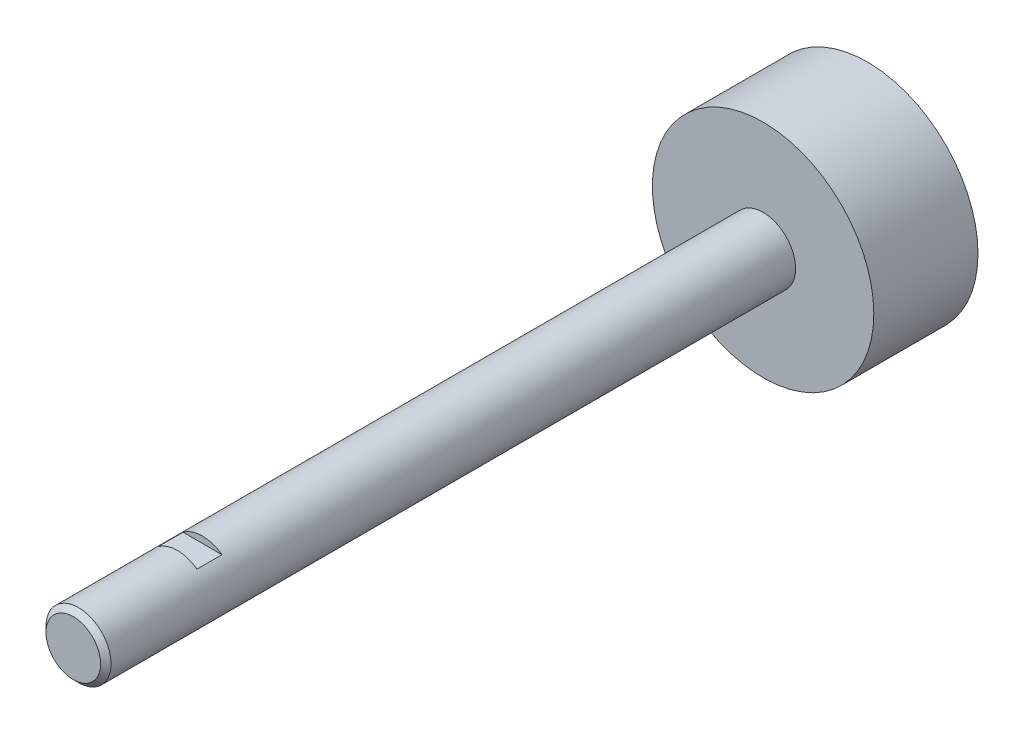
ISO-10303-21;
HEADER;
FILE_DESCRIPTION(('STEP AP214'),'2;1');
FILE_NAME('part.step','',(''),(''),'','','');
FILE_SCHEMA(('AUTOMOTIVE_DESIGN { 1 0 10303 214 1 1 1 1 }'));
ENDSEC;
DATA;
#1=APPLICATION_CONTEXT('core data for automotive mechanical design processes');
#2=APPLICATION_PROTOCOL_DEFINITION('international standard','automotive_design',2000,#1);
#3=PRODUCT_CONTEXT('',#1,'mechanical');
#4=PRODUCT('Part','Part','',(#3));
#5=PRODUCT_RELATED_PRODUCT_CATEGORY('part','',(#4));
#6=PRODUCT_DEFINITION_FORMATION('','',#4);
#7=PRODUCT_DEFINITION_CONTEXT('part definition',#1,'design');
#8=PRODUCT_DEFINITION('design','',#6,#7);
#9=PRODUCT_DEFINITION_SHAPE('','',#8);
#10=(LENGTH_UNIT() NAMED_UNIT(*) SI_UNIT(.MILLI.,.METRE.));
#11=(NAMED_UNIT(*) PLANE_ANGLE_UNIT() SI_UNIT($,.RADIAN.));
#12=(NAMED_UNIT(*) SI_UNIT($,.STERADIAN.) SOLID_ANGLE_UNIT());
#13=UNCERTAINTY_MEASURE_WITH_UNIT(LENGTH_MEASURE(1.E-05),#10,'distance_accuracy_value','');
#14=(GEOMETRIC_REPRESENTATION_CONTEXT(3) GLOBAL_UNCERTAINTY_ASSIGNED_CONTEXT((#13)) GLOBAL_UNIT_ASSIGNED_CONTEXT((#10,
#11,#12)) REPRESENTATION_CONTEXT('',''));
#15=CARTESIAN_POINT('',(0.,0.,0.));
#16=DIRECTION('',(0.,0.,1.));
#17=DIRECTION('',(1.,0.,0.));
#18=AXIS2_PLACEMENT_3D('',#15,#16,#17);
#19=CARTESIAN_POINT('',(-17.9826826144289,-14.224,-3.04800000000014));
#20=DIRECTION('',(0.,0.,-1.));
#21=DIRECTION('',(-1.,0.,0.));
#22=AXIS2_PLACEMENT_3D('',#19,#20,#21);
#23=PLANE('',#22);
#24=CARTESIAN_POINT('',(0.,0.,-3.04800000000014));
#25=DIRECTION('',(0.,0.,1.));
#26=DIRECTION('',(-0.429692042512657,0.902975497231957,0.));
#27=AXIS2_PLACEMENT_3D('',#24,#25,#26);
#28=CIRCLE('',#27,3.9624);
#29=CARTESIAN_POINT('',(-2.37065154757083,-3.175,-3.04800000000014));
#30=VERTEX_POINT('',#29);
#31=CARTESIAN_POINT('',(2.37065154757083,-3.175,-3.04800000000014));
#32=VERTEX_POINT('',#31);
#33=EDGE_CURVE('E127',#30,#32,#28,.T.);
#34=ORIENTED_EDGE('',*,*,#33,.T.);
#35=DIRECTION('',(1.,0.,0.));
#36=VECTOR('',#35,1.);
#37=CARTESIAN_POINT('',(-17.9826826144289,-3.175,-3.04800000000014));
#38=LINE('',#37,#36);
#39=EDGE_CURVE('E11',#30,#32,#38,.T.);
#40=ORIENTED_EDGE('',*,*,#39,.F.);
#41=EDGE_LOOP('',(#34,#40));
#42=FACE_BOUND('',#41,.T.);
#43=ADVANCED_FACE('F16',(#42),#23,.F.);
#44=CARTESIAN_POINT('',(-17.9826826144289,-3.175,0.));
#45=DIRECTION('',(0.,1.,0.));
#46=DIRECTION('',(0.,0.,-1.));
#47=AXIS2_PLACEMENT_3D('',#44,#45,#46);
#48=PLANE('',#47);
#49=DIRECTION('',(0.,0.,-1.));
#50=VECTOR('',#49,1.);
#51=CARTESIAN_POINT('',(-2.3706515475708,-3.175,-95.2813596390943));
#52=LINE('',#51,#50);
#53=CARTESIAN_POINT('',(-2.3706515475708,-3.175,0.));
#54=VERTEX_POINT('',#53);
#55=EDGE_CURVE('E132',#54,#30,#52,.T.);
#56=ORIENTED_EDGE('',*,*,#55,.T.);
#57=ORIENTED_EDGE('',*,*,#39,.T.);
#58=DIRECTION('',(0.,0.,1.));
#59=VECTOR('',#58,1.);
#60=CARTESIAN_POINT('',(2.3706515475708,-3.175,-95.2813596390943));
#61=LINE('',#60,#59);
#62=CARTESIAN_POINT('',(2.37065154757081,-3.175,0.));
#63=VERTEX_POINT('',#62);
#64=EDGE_CURVE('E123',#32,#63,#61,.T.);
#65=ORIENTED_EDGE('',*,*,#64,.T.);
#66=DIRECTION('',(1.,0.,0.));
#67=VECTOR('',#66,1.);
#68=CARTESIAN_POINT('',(-17.9826826144289,-3.175,0.));
#69=LINE('',#68,#67);
#70=EDGE_CURVE('E26',#54,#63,#69,.T.);
#71=ORIENTED_EDGE('',*,*,#70,.F.);
#72=EDGE_LOOP('',(#56,#57,#65,#71));
#73=FACE_BOUND('',#72,.T.);
#74=ADVANCED_FACE('F161',(#73),#48,.F.);
#75=CARTESIAN_POINT('',(-17.9826826144289,-14.224,0.));
#76=DIRECTION('',(0.,0.,1.));
#77=DIRECTION('',(0.,-1.,0.));
#78=AXIS2_PLACEMENT_3D('',#75,#76,#77);
#79=PLANE('',#78);
#80=CARTESIAN_POINT('',(0.,0.,0.));
#81=DIRECTION('',(0.,0.,-1.));
#82=DIRECTION('',(0.429692042512659,-0.902975497231957,0.));
#83=AXIS2_PLACEMENT_3D('',#80,#81,#82);
#84=CIRCLE('',#83,3.9624);
#85=EDGE_CURVE('E120',#63,#54,#84,.T.);
#86=ORIENTED_EDGE('',*,*,#85,.T.);
#87=ORIENTED_EDGE('',*,*,#70,.T.);
#88=EDGE_LOOP('',(#86,#87));
#89=FACE_BOUND('',#88,.T.);
#90=ADVANCED_FACE('F172',(#89),#79,.F.);
#91=CARTESIAN_POINT('',(-17.9826826144289,3.175,0.));
#92=DIRECTION('',(0.,-1.,0.));
#93=DIRECTION('',(0.,0.,-1.));
#94=AXIS2_PLACEMENT_3D('',#91,#92,#93);
#95=PLANE('',#94);
#96=DIRECTION('',(0.,0.,-1.));
#97=VECTOR('',#96,1.);
#98=CARTESIAN_POINT('',(2.37065154757076,3.17500000000005,-95.2813596390943));
#99=LINE('',#98,#97);
#100=CARTESIAN_POINT('',(2.37065154757077,3.175,0.));
#101=VERTEX_POINT('',#100);
#102=CARTESIAN_POINT('',(2.37065154757077,3.175,-3.04800000000014));
#103=VERTEX_POINT('',#102);
#104=EDGE_CURVE('E128',#101,#103,#99,.T.);
#105=ORIENTED_EDGE('',*,*,#104,.T.);
#106=DIRECTION('',(1.,0.,0.));
#107=VECTOR('',#106,1.);
#108=CARTESIAN_POINT('',(-17.9826826144289,3.175,-3.04800000000014));
#109=LINE('',#108,#107);
#110=CARTESIAN_POINT('',(-2.37065154757076,3.17500000000005,-3.04800000000014));
#111=VERTEX_POINT('',#110);
#112=EDGE_CURVE('E20',#111,#103,#109,.T.);
#113=ORIENTED_EDGE('',*,*,#112,.F.);
#114=DIRECTION('',(0.,0.,1.));
#115=VECTOR('',#114,1.);
#116=CARTESIAN_POINT('',(-2.37065154757076,3.17500000000005,-95.2813596390943));
#117=LINE('',#116,#115);
#118=CARTESIAN_POINT('',(-2.37065154757076,3.175,0.));
#119=VERTEX_POINT('',#118);
#120=EDGE_CURVE('E149',#111,#119,#117,.T.);
#121=ORIENTED_EDGE('',*,*,#120,.T.);
#122=DIRECTION('',(1.,0.,0.));
#123=VECTOR('',#122,1.);
#124=CARTESIAN_POINT('',(-17.9826826144289,3.175,0.));
#125=LINE('',#124,#123);
#126=EDGE_CURVE('E49',#119,#101,#125,.T.);
#127=ORIENTED_EDGE('',*,*,#126,.T.);
#128=EDGE_LOOP('',(#105,#113,#121,#127));
#129=FACE_BOUND('',#128,.T.);
#130=ADVANCED_FACE('F175',(#129),#95,.F.);
#131=CARTESIAN_POINT('',(-17.9826826144289,14.224,-3.04800000000014));
#132=DIRECTION('',(0.,0.,-1.));
#133=DIRECTION('',(-1.,0.,0.));
#134=AXIS2_PLACEMENT_3D('',#131,#132,#133);
#135=PLANE('',#134);
#136=CARTESIAN_POINT('',(0.,0.,-3.04800000000014));
#137=DIRECTION('',(0.,0.,1.));
#138=DIRECTION('',(-0.429692042512659,0.902975497231957,0.));
#139=AXIS2_PLACEMENT_3D('',#136,#137,#138);
#140=CIRCLE('',#139,3.9624);
#141=EDGE_CURVE('E146',#103,#111,#140,.T.);
#142=ORIENTED_EDGE('',*,*,#141,.T.);
#143=ORIENTED_EDGE('',*,*,#112,.T.);
#144=EDGE_LOOP('',(#142,#143));
#145=FACE_BOUND('',#144,.T.);
#146=ADVANCED_FACE('F178',(#145),#135,.F.);
#147=CARTESIAN_POINT('',(-17.9826826144289,14.224,0.));
#148=DIRECTION('',(0.,0.,1.));
#149=DIRECTION('',(1.,0.,0.));
#150=AXIS2_PLACEMENT_3D('',#147,#148,#149);
#151=PLANE('',#150);
#152=CARTESIAN_POINT('',(0.,0.,0.));
#153=DIRECTION('',(0.,0.,-1.));
#154=DIRECTION('',(0.902975497231956,0.42969204251266,0.));
#155=AXIS2_PLACEMENT_3D('',#152,#153,#154);
#156=CIRCLE('',#155,3.9624);
#157=EDGE_CURVE('E131',#119,#101,#156,.T.);
#158=ORIENTED_EDGE('',*,*,#157,.T.);
#159=ORIENTED_EDGE('',*,*,#126,.F.);
#160=EDGE_LOOP('',(#158,#159));
#161=FACE_BOUND('',#160,.T.);
#162=ADVANCED_FACE('F179',(#161),#151,.F.);
#163=CARTESIAN_POINT('',(0.,0.,-84.074));
#164=DIRECTION('',(0.,0.,1.));
#165=DIRECTION('',(1.,0.,0.));
#166=AXIS2_PLACEMENT_3D('',#163,#164,#165);
#167=PLANE('',#166);
#168=CARTESIAN_POINT('',(0.,0.,-84.074));
#169=DIRECTION('',(0.,0.,1.));
#170=DIRECTION('',(0.902975497231957,0.429692042512659,0.));
#171=AXIS2_PLACEMENT_3D('',#168,#169,#170);
#172=CIRCLE('',#171,13.49375);
#173=CARTESIAN_POINT('',(12.1845256157737,5.79815699865519,-84.074));
#174=VERTEX_POINT('',#173);
#175=EDGE_CURVE('E62',#174,#174,#172,.T.);
#176=ORIENTED_EDGE('',*,*,#175,.F.);
#177=EDGE_LOOP('',(#176));
#178=FACE_BOUND('',#177,.T.);
#179=ADVANCED_FACE('F182',(#178),#167,.F.);
#180=CARTESIAN_POINT('',(0.,0.,-71.374));
#181=DIRECTION('',(0.,0.,1.));
#182=DIRECTION('',(0.,-1.,0.));
#183=AXIS2_PLACEMENT_3D('',#180,#181,#182);
#184=PLANE('',#183);
#185=CARTESIAN_POINT('',(0.,0.,-71.374));
#186=DIRECTION('',(0.,0.,-1.));
#187=DIRECTION('',(0.902975497231957,0.429692042512659,0.));
#188=AXIS2_PLACEMENT_3D('',#185,#186,#187);
#189=CIRCLE('',#188,3.9624);
#190=CARTESIAN_POINT('',(-3.5779501102319,-1.70261174925216,-71.374));
#191=VERTEX_POINT('',#190);
#192=EDGE_CURVE('E124',#191,#191,#189,.T.);
#193=ORIENTED_EDGE('',*,*,#192,.T.);
#194=EDGE_LOOP('',(#193));
#195=FACE_BOUND('',#194,.T.);
#196=CARTESIAN_POINT('',(0.,0.,-71.374));
#197=DIRECTION('',(0.,0.,1.));
#198=DIRECTION('',(0.902975497231957,0.429692042512659,0.));
#199=AXIS2_PLACEMENT_3D('',#196,#197,#198);
#200=CIRCLE('',#199,13.49375);
#201=CARTESIAN_POINT('',(12.1845256157737,5.79815699865519,-71.374));
#202=VERTEX_POINT('',#201);
#203=EDGE_CURVE('E75',#202,#202,#200,.T.);
#204=ORIENTED_EDGE('',*,*,#203,.T.);
#205=EDGE_LOOP('',(#204));
#206=FACE_BOUND('',#205,.T.);
#207=ADVANCED_FACE('F188',(#195,#206),#184,.T.);
#208=CARTESIAN_POINT('',(0.,0.,12.7));
#209=DIRECTION('',(0.,0.,1.));
#210=DIRECTION('',(0.,-1.,0.));
#211=AXIS2_PLACEMENT_3D('',#208,#209,#210);
#212=PLANE('',#211);
#213=CARTESIAN_POINT('',(0.,0.,12.7));
#214=DIRECTION('',(0.,0.,1.));
#215=DIRECTION('',(0.902975497231957,0.429692042512659,0.));
#216=AXIS2_PLACEMENT_3D('',#213,#214,#215);
#217=CIRCLE('',#216,3.32739999999994);
#218=CARTESIAN_POINT('',(3.00456066948956,1.4297573022566,12.7));
#219=VERTEX_POINT('',#218);
#220=EDGE_CURVE('E106',#219,#219,#217,.T.);
#221=ORIENTED_EDGE('',*,*,#220,.T.);
#222=EDGE_LOOP('',(#221));
#223=FACE_BOUND('',#222,.T.);
#224=ADVANCED_FACE('F107',(#223),#212,.T.);
#225=CARTESIAN_POINT('',(0.,0.,-95.2813596390943));
#226=DIRECTION('',(0.,0.,1.));
#227=DIRECTION('',(0.902975497231957,0.429692042512659,0.));
#228=AXIS2_PLACEMENT_3D('',#225,#226,#227);
#229=CYLINDRICAL_SURFACE('',#228,3.9624);
#230=ORIENTED_EDGE('',*,*,#104,.F.);
#231=ORIENTED_EDGE('',*,*,#157,.F.);
#232=ORIENTED_EDGE('',*,*,#120,.F.);
#233=ORIENTED_EDGE('',*,*,#141,.F.);
#234=EDGE_LOOP('',(#230,#231,#232,#233));
#235=FACE_BOUND('',#234,.T.);
#236=ORIENTED_EDGE('',*,*,#85,.F.);
#237=ORIENTED_EDGE('',*,*,#64,.F.);
#238=ORIENTED_EDGE('',*,*,#33,.F.);
#239=ORIENTED_EDGE('',*,*,#55,.F.);
#240=EDGE_LOOP('',(#236,#237,#238,#239));
#241=FACE_BOUND('',#240,.T.);
#242=CARTESIAN_POINT('',(0.,0.,12.065));
#243=DIRECTION('',(0.,0.,-1.));
#244=DIRECTION('',(0.902975497231957,0.429692042512659,0.));
#245=AXIS2_PLACEMENT_3D('',#242,#243,#244);
#246=CIRCLE('',#245,3.9624);
#247=CARTESIAN_POINT('',(3.57795011023197,1.70261174925219,12.065));
#248=VERTEX_POINT('',#247);
#249=EDGE_CURVE('E110',#248,#248,#246,.T.);
#250=ORIENTED_EDGE('',*,*,#249,.T.);
#251=EDGE_LOOP('',(#250));
#252=FACE_BOUND('',#251,.T.);
#253=ORIENTED_EDGE('',*,*,#192,.F.);
#254=EDGE_LOOP('',(#253));
#255=FACE_BOUND('',#254,.T.);
#256=ADVANCED_FACE('F18',(#235,#241,#252,#255),#229,.T.);
#257=CARTESIAN_POINT('',(0.,0.,-71.374));
#258=DIRECTION('',(0.,0.,-1.));
#259=DIRECTION('',(-0.902975497231957,-0.429692042512659,0.));
#260=AXIS2_PLACEMENT_3D('',#257,#258,#259);
#261=CYLINDRICAL_SURFACE('',#260,13.49375);
#262=ORIENTED_EDGE('',*,*,#175,.T.);
#263=EDGE_LOOP('',(#262));
#264=FACE_BOUND('',#263,.T.);
#265=ORIENTED_EDGE('',*,*,#203,.F.);
#266=EDGE_LOOP('',(#265));
#267=FACE_BOUND('',#266,.T.);
#268=ADVANCED_FACE('F193',(#264,#267),#261,.T.);
#269=CARTESIAN_POINT('',(0.,0.,12.7));
#270=DIRECTION('',(0.,0.,-1.));
#271=DIRECTION('',(-0.902975497231957,-0.429692042512659,0.));
#272=AXIS2_PLACEMENT_3D('',#269,#270,#271);
#273=CONICAL_SURFACE('',#272,3.32739999999994,0.785398163397453);
#274=ORIENTED_EDGE('',*,*,#249,.F.);
#275=EDGE_LOOP('',(#274));
#276=FACE_BOUND('',#275,.T.);
#277=ORIENTED_EDGE('',*,*,#220,.F.);
#278=EDGE_LOOP('',(#277));
#279=FACE_BOUND('',#278,.T.);
#280=ADVANCED_FACE('F190',(#276,#279),#273,.T.);
#281=CLOSED_SHELL('',(#43,#74,#90,#130,#146,#162,#179,#207,#224,#256,#268,#280));
#282=MANIFOLD_SOLID_BREP('B1',#281);
#283=ADVANCED_BREP_SHAPE_REPRESENTATION('',(#18,#282),#14);
#284=SHAPE_DEFINITION_REPRESENTATION(#9,#283);
ENDSEC;
END-ISO-10303-21;
